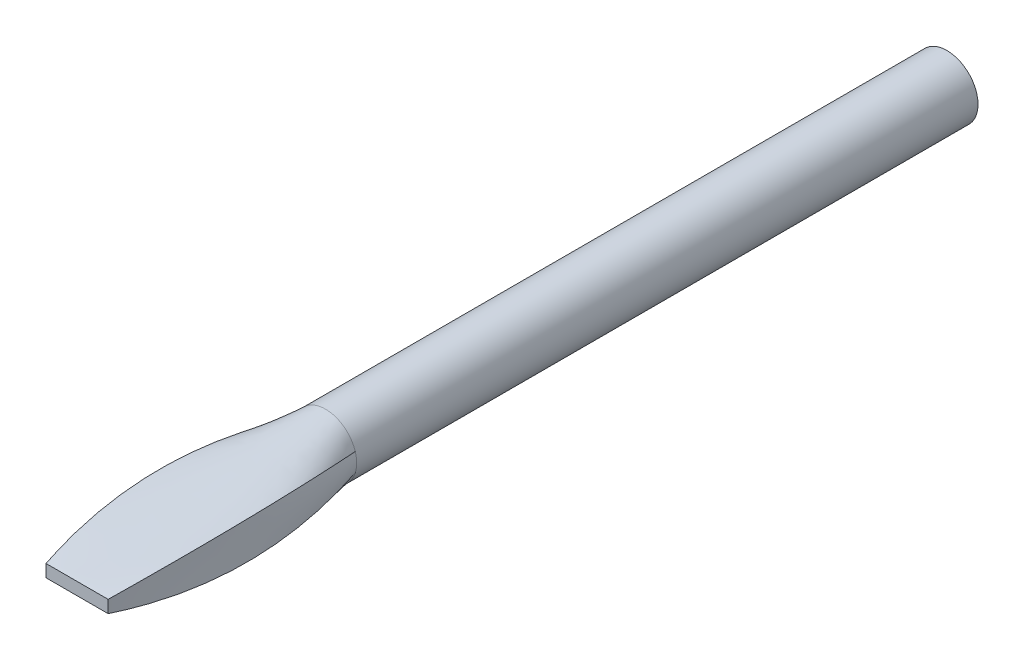
ISO-10303-21;
HEADER;
FILE_DESCRIPTION(('STEP AP214'),'2;1');
FILE_NAME('part.step','',(''),(''),'','','');
FILE_SCHEMA(('AUTOMOTIVE_DESIGN { 1 0 10303 214 1 1 1 1 }'));
ENDSEC;
DATA;
#1=APPLICATION_CONTEXT('core data for automotive mechanical design processes');
#2=APPLICATION_PROTOCOL_DEFINITION('international standard','automotive_design',2000,#1);
#3=PRODUCT_CONTEXT('',#1,'mechanical');
#4=PRODUCT('Part','Part','',(#3));
#5=PRODUCT_RELATED_PRODUCT_CATEGORY('part','',(#4));
#6=PRODUCT_DEFINITION_FORMATION('','',#4);
#7=PRODUCT_DEFINITION_CONTEXT('part definition',#1,'design');
#8=PRODUCT_DEFINITION('design','',#6,#7);
#9=PRODUCT_DEFINITION_SHAPE('','',#8);
#10=(LENGTH_UNIT() NAMED_UNIT(*) SI_UNIT(.MILLI.,.METRE.));
#11=(NAMED_UNIT(*) PLANE_ANGLE_UNIT() SI_UNIT($,.RADIAN.));
#12=(NAMED_UNIT(*) SI_UNIT($,.STERADIAN.) SOLID_ANGLE_UNIT());
#13=UNCERTAINTY_MEASURE_WITH_UNIT(LENGTH_MEASURE(1.E-05),#10,'distance_accuracy_value','');
#14=(GEOMETRIC_REPRESENTATION_CONTEXT(3) GLOBAL_UNCERTAINTY_ASSIGNED_CONTEXT((#13)) GLOBAL_UNIT_ASSIGNED_CONTEXT((#10,
#11,#12)) REPRESENTATION_CONTEXT('',''));
#15=CARTESIAN_POINT('',(0.,0.,0.));
#16=DIRECTION('',(0.,0.,1.));
#17=DIRECTION('',(1.,0.,0.));
#18=AXIS2_PLACEMENT_3D('',#15,#16,#17);
#19=CARTESIAN_POINT('',(0.,0.,-50.8));
#20=DIRECTION('',(0.,0.,-1.));
#21=DIRECTION('',(-1.,0.,0.));
#22=AXIS2_PLACEMENT_3D('',#19,#20,#21);
#23=CYLINDRICAL_SURFACE('',#22,6.35);
#24=CARTESIAN_POINT('',(6.06423657555215,1.88349004662501,-50.8));
#25=CARTESIAN_POINT('',(5.85804113848447,2.54737351838447,-50.8));
#26=CARTESIAN_POINT('',(5.2417074743179,3.76863298969801,-50.8));
#27=CARTESIAN_POINT('',(4.06203593613262,4.95911676968399,-50.8));
#28=CARTESIAN_POINT('',(2.93504285366169,5.65907860035766,-50.8));
#29=CARTESIAN_POINT('',(1.71223348435848,6.18054823227697,-50.8));
#30=CARTESIAN_POINT('',(-0.000193322838781427,6.46351838530499,-50.8));
#31=CARTESIAN_POINT('',(-1.71185651781168,6.18061152104127,-50.7999999999999));
#32=CARTESIAN_POINT('',(-2.935103628648,5.65908154799099,-50.8000000000001));
#33=CARTESIAN_POINT('',(-4.06188804313585,4.95920080897502,-50.8));
#34=CARTESIAN_POINT('',(-5.24179598211128,3.76858211592941,-50.8));
#35=CARTESIAN_POINT('',(-5.85804113848447,2.54737351838447,-50.8));
#36=CARTESIAN_POINT('',(-6.06423657555215,1.88349004662501,-50.8));
#37=B_SPLINE_CURVE_WITH_KNOTS('',3,(#24,#25,#26,#27,#28,#29,#30,#31,#32,#33,#34,#35,#36),
.UNSPECIFIED.,.F.,.F.,(4,1,1,1,1,1,1,1,1,1,4),(0.,0.125,0.25,0.3125,0.375,0.5,0.625,0.6875,0.75,
0.875,1.),.UNSPECIFIED.);
#38=CARTESIAN_POINT('',(6.06427068664734,1.88350064960726,-50.8));
#39=VERTEX_POINT('',#38);
#40=CARTESIAN_POINT('',(-6.06427243663805,1.88350118339388,-50.8));
#41=VERTEX_POINT('',#40);
#42=EDGE_CURVE('E12',#39,#41,#37,.T.);
#43=ORIENTED_EDGE('',*,*,#42,.F.);
#44=CARTESIAN_POINT('',(0.,0.,-50.8));
#45=DIRECTION('',(0.,0.,-1.));
#46=DIRECTION('',(1.,0.,0.));
#47=AXIS2_PLACEMENT_3D('',#44,#45,#46);
#48=CIRCLE('',#47,6.35);
#49=CARTESIAN_POINT('',(6.06427243663801,-1.88350118339387,-50.8));
#50=VERTEX_POINT('',#49);
#51=EDGE_CURVE('E126',#50,#39,#48,.F.);
#52=ORIENTED_EDGE('',*,*,#51,.F.);
#53=CARTESIAN_POINT('',(0.,0.,-50.8));
#54=DIRECTION('',(0.,0.,1.));
#55=DIRECTION('',(1.,0.,0.));
#56=AXIS2_PLACEMENT_3D('',#53,#54,#55);
#57=CIRCLE('',#56,6.35);
#58=CARTESIAN_POINT('',(-6.06427068664692,-1.88350064960712,-50.8));
#59=VERTEX_POINT('',#58);
#60=EDGE_CURVE('E113',#59,#50,#57,.T.);
#61=ORIENTED_EDGE('',*,*,#60,.F.);
#62=CARTESIAN_POINT('',(0.,0.,-50.8));
#63=DIRECTION('',(0.,0.,1.));
#64=DIRECTION('',(1.,0.,0.));
#65=AXIS2_PLACEMENT_3D('',#62,#63,#64);
#66=CIRCLE('',#65,6.35);
#67=EDGE_CURVE('E131',#41,#59,#66,.T.);
#68=ORIENTED_EDGE('',*,*,#67,.F.);
#69=EDGE_LOOP('',(#43,#52,#61,#68));
#70=FACE_BOUND('',#69,.T.);
#71=CARTESIAN_POINT('',(0.,0.,-177.8));
#72=DIRECTION('',(0.,0.,1.));
#73=DIRECTION('',(1.,0.,0.));
#74=AXIS2_PLACEMENT_3D('',#71,#72,#73);
#75=CIRCLE('',#74,6.35);
#76=CARTESIAN_POINT('',(6.35,0.,-177.8));
#77=VERTEX_POINT('',#76);
#78=EDGE_CURVE('E119',#77,#77,#75,.T.);
#79=ORIENTED_EDGE('',*,*,#78,.T.);
#80=EDGE_LOOP('',(#79));
#81=FACE_BOUND('',#80,.T.);
#82=ADVANCED_FACE('F109',(#70,#81),#23,.T.);
#83=CARTESIAN_POINT('',(0.,0.,-177.8));
#84=DIRECTION('',(0.,0.,1.));
#85=DIRECTION('',(1.,0.,0.));
#86=AXIS2_PLACEMENT_3D('',#83,#84,#85);
#87=PLANE('',#86);
#88=ORIENTED_EDGE('',*,*,#78,.F.);
#89=EDGE_LOOP('',(#88));
#90=FACE_BOUND('',#89,.T.);
#91=ADVANCED_FACE('F300',(#90),#87,.F.);
#92=CARTESIAN_POINT('',(0.,0.,0.));
#93=DIRECTION('',(0.,0.,1.));
#94=DIRECTION('',(1.,0.,0.));
#95=AXIS2_PLACEMENT_3D('',#92,#93,#94);
#96=PLANE('',#95);
#97=DIRECTION('',(0.,-1.,0.));
#98=VECTOR('',#97,1.);
#99=CARTESIAN_POINT('',(-6.35,1.27,0.));
#100=LINE('',#99,#98);
#101=CARTESIAN_POINT('',(-6.35,1.27,0.));
#102=VERTEX_POINT('',#101);
#103=CARTESIAN_POINT('',(-6.35,-1.27,0.));
#104=VERTEX_POINT('',#103);
#105=EDGE_CURVE('E156',#102,#104,#100,.T.);
#106=ORIENTED_EDGE('',*,*,#105,.T.);
#107=DIRECTION('',(1.,0.,0.));
#108=VECTOR('',#107,1.);
#109=CARTESIAN_POINT('',(-6.35,-1.27,0.));
#110=LINE('',#109,#108);
#111=CARTESIAN_POINT('',(6.35,-1.27,0.));
#112=VERTEX_POINT('',#111);
#113=EDGE_CURVE('E176',#104,#112,#110,.T.);
#114=ORIENTED_EDGE('',*,*,#113,.T.);
#115=DIRECTION('',(0.,1.,0.));
#116=VECTOR('',#115,1.);
#117=CARTESIAN_POINT('',(6.35,1.27,0.));
#118=LINE('',#117,#116);
#119=CARTESIAN_POINT('',(6.35,1.27,0.));
#120=VERTEX_POINT('',#119);
#121=EDGE_CURVE('E158',#112,#120,#118,.T.);
#122=ORIENTED_EDGE('',*,*,#121,.T.);
#123=DIRECTION('',(-1.,0.,0.));
#124=VECTOR('',#123,1.);
#125=CARTESIAN_POINT('',(-6.35,1.27,0.));
#126=LINE('',#125,#124);
#127=EDGE_CURVE('E151',#120,#102,#126,.T.);
#128=ORIENTED_EDGE('',*,*,#127,.T.);
#129=EDGE_LOOP('',(#106,#114,#122,#128));
#130=FACE_BOUND('',#129,.T.);
#131=ADVANCED_FACE('F154',(#130),#96,.T.);
#132=CARTESIAN_POINT('',(6.06423657555215,1.88349004662501,-50.8));
#133=CARTESIAN_POINT('',(7.90047388974248,3.27003054932142,-42.3293746512095));
#134=CARTESIAN_POINT('',(9.78431553948999,4.55437215944736,-25.3961706986833));
#135=CARTESIAN_POINT('',(8.09098283937438,2.86103718490474,-8.46270798454288));
#136=CARTESIAN_POINT('',(6.35,1.27,0.));
#137=CARTESIAN_POINT('',(5.85804113848447,2.54737351838447,-50.8));
#138=CARTESIAN_POINT('',(7.42093232332861,3.616845288089,-42.3198769073977));
#139=CARTESIAN_POINT('',(8.89957221242282,4.43385460008674,-25.4056684434996));
#140=CARTESIAN_POINT('',(7.37656967394205,2.75504928625989,-8.45321024073105));
#141=CARTESIAN_POINT('',(5.82083333333333,1.27,0.));
#142=CARTESIAN_POINT('',(5.2417074743179,3.76863298969801,-50.8));
#143=CARTESIAN_POINT('',(6.25790640046964,4.20396729341881,-42.3008814197741));
#144=CARTESIAN_POINT('',(7.23210386280418,4.24609771557512,-25.4246639331323));
#145=CARTESIAN_POINT('',(5.94774334307739,2.54307348897019,-8.4342147531074));
#146=CARTESIAN_POINT('',(4.7625,1.27,0.));
#147=CARTESIAN_POINT('',(4.06203593613262,4.95911676968399,-50.8));
#148=CARTESIAN_POINT('',(4.66948548773717,4.80713068019484,-42.3118121008502));
#149=CARTESIAN_POINT('',(5.16931230338842,4.0423102869184,-25.4137332509001));
#150=CARTESIAN_POINT('',(4.25336526489078,2.34711738515885,-8.44514543418357));
#151=CARTESIAN_POINT('',(3.43958333333333,1.27,0.));
#152=CARTESIAN_POINT('',(2.93504285366169,5.65907860035766,-50.8));
#153=CARTESIAN_POINT('',(3.29269835402437,5.15660841909619,-42.3207888898428));
#154=CARTESIAN_POINT('',(3.55920865650742,3.92568919199222,-25.4047564609581));
#155=CARTESIAN_POINT('',(2.92371467758366,2.23066752189838,-8.45412222317609));
#156=CARTESIAN_POINT('',(2.38125,1.27,0.));
#157=CARTESIAN_POINT('',(1.71223348435848,6.18054823227697,-50.8));
#158=CARTESIAN_POINT('',(1.87051705532128,5.41832523587703,-42.3297426797861));
#159=CARTESIAN_POINT('',(1.96342095127046,3.83780479373292,-25.3958026700678));
#160=CARTESIAN_POINT('',(1.61085497517112,2.14455951136192,-8.46307601311945));
#161=CARTESIAN_POINT('',(1.32291666666667,1.27,0.));
#162=CARTESIAN_POINT('',(-0.000193322838781427,6.46351838530499,-50.8));
#163=CARTESIAN_POINT('',(-9.66702680043319E-05,5.56028155683576,-42.3357360755949));
#164=CARTESIAN_POINT('',(3.22497012284137E-05,3.79007273909321,-25.3898092736251));
#165=CARTESIAN_POINT('',(3.22301563003236E-05,2.0979805784034,-8.46906940892825));
#166=CARTESIAN_POINT('',(0.,1.27,0.));
#167=CARTESIAN_POINT('',(-1.71185651781168,6.18061152104127,-50.7999999999999));
#168=CARTESIAN_POINT('',(-1.87032854552464,5.41835704516322,-42.3297440608275));
#169=CARTESIAN_POINT('',(-1.96348383556476,3.83779408565037,-25.3958012890262));
#170=CARTESIAN_POINT('',(-1.61091783200104,2.14454909881991,-8.46307739416092));
#171=CARTESIAN_POINT('',(-1.32291666666667,1.27,0.));
#172=CARTESIAN_POINT('',(-2.935103628648,5.65908154799099,-50.8000000000001));
#173=CARTESIAN_POINT('',(-3.29272887156439,5.15660981106642,-42.3207888521752));
#174=CARTESIAN_POINT('',(-3.559198434286,3.92568875573983,-25.4047564986257));
#175=CARTESIAN_POINT('',(-2.92370458580722,2.23066700155333,-8.45412218550851));
#176=CARTESIAN_POINT('',(-2.38125,1.27,0.));
#177=CARTESIAN_POINT('',(-4.06188804313585,4.95920080897502,-50.8));
#178=CARTESIAN_POINT('',(-4.66941085262581,4.80717319138082,-42.3118133437021));
#179=CARTESIAN_POINT('',(-5.16933741344583,4.04229591953955,-25.4137320080481));
#180=CARTESIAN_POINT('',(-4.25338972546873,2.34710358282778,-8.44514667703548));
#181=CARTESIAN_POINT('',(-3.43958333333333,1.27,0.));
#182=CARTESIAN_POINT('',(-5.24179598211128,3.76858211592941,-50.8));
#183=CARTESIAN_POINT('',(-6.2579566773203,4.20393834953867,-42.3008807415742));
#184=CARTESIAN_POINT('',(-7.23208509401576,4.24610854884719,-25.4246646113323));
#185=CARTESIAN_POINT('',(-5.94773057480386,2.54308078297502,-8.43421407490755));
#186=CARTESIAN_POINT('',(-4.7625,1.27,0.));
#187=CARTESIAN_POINT('',(-5.85804113848447,2.54737351838447,-50.8));
#188=CARTESIAN_POINT('',(-7.42091957968103,3.61685259805183,-42.3198766813311));
#189=CARTESIAN_POINT('',(-8.89958071424488,4.43384972831545,-25.4056686695663));
#190=CARTESIAN_POINT('',(-7.37656541785087,2.75505171759483,-8.45321001466444));
#191=CARTESIAN_POINT('',(-5.82083333333333,1.27,0.));
#192=CARTESIAN_POINT('',(-6.06423657555215,1.88349004662501,-50.8));
#193=CARTESIAN_POINT('',(-7.90047388974248,3.27003054932142,-42.3293746512095));
#194=CARTESIAN_POINT('',(-9.78431553948999,4.55437215944736,-25.3961706986833));
#195=CARTESIAN_POINT('',(-8.09098283937437,2.86103718490474,-8.46270798454288));
#196=CARTESIAN_POINT('',(-6.35,1.27,0.));
#197=B_SPLINE_SURFACE_WITH_KNOTS('',3,3,((#132,#133,#134,#135,#136),(#137,#138,#139,#140,#141),
(#142,#143,#144,#145,#146),(#147,#148,#149,#150,#151),(#152,#153,#154,#155,#156),(#157,#158,
#159,#160,#161),(#162,#163,#164,#165,#166),(#167,#168,#169,#170,#171),(#172,#173,#174,#175,
#176),(#177,#178,#179,#180,#181),(#182,#183,#184,#185,#186),(#187,#188,#189,#190,#191),(#192,
#193,#194,#195,#196)),.UNSPECIFIED.,.F.,.F.,.F.,(4,1,1,1,1,1,1,1,1,1,4),(4,1,4),(0.,0.125,0.25,
0.3125,0.375,0.5,0.625,0.6875,0.75,0.875,1.),(0.,0.49988501992942,1.),.UNSPECIFIED.);
#198=CARTESIAN_POINT('',(-6.06423657555215,1.88349004662501,-50.8));
#199=CARTESIAN_POINT('',(-7.90047388974248,3.27003054932142,-42.3293746512095));
#200=CARTESIAN_POINT('',(-9.78431553948999,4.55437215944736,-25.3961706986833));
#201=CARTESIAN_POINT('',(-8.09098283937437,2.86103718490474,-8.46270798454288));
#202=CARTESIAN_POINT('',(-6.35,1.27,0.));
#203=B_SPLINE_CURVE_WITH_KNOTS('',3,(#198,#199,#200,#201,#202),.UNSPECIFIED.,.F.,.F.,(4,1,4),
(0.,0.49988501992942,1.),.UNSPECIFIED.);
#204=EDGE_CURVE('E173',#41,#102,#203,.T.);
#205=CARTESIAN_POINT('',(6.06423657555215,1.88349004662501,-50.8));
#206=CARTESIAN_POINT('',(7.90047388974248,3.27003054932142,-42.3293746512095));
#207=CARTESIAN_POINT('',(9.78431553948999,4.55437215944736,-25.3961706986833));
#208=CARTESIAN_POINT('',(8.09098283937438,2.86103718490474,-8.46270798454288));
#209=CARTESIAN_POINT('',(6.35,1.27,0.));
#210=B_SPLINE_CURVE_WITH_KNOTS('',3,(#205,#206,#207,#208,#209),.UNSPECIFIED.,.F.,.F.,(4,1,4),
(0.,0.49988501992942,1.),.UNSPECIFIED.);
#211=EDGE_CURVE('E164',#120,#39,#210,.F.);
#212=ORIENTED_EDGE('',*,*,#42,.T.);
#213=ORIENTED_EDGE('',*,*,#204,.T.);
#214=ORIENTED_EDGE('',*,*,#127,.F.);
#215=ORIENTED_EDGE('',*,*,#211,.T.);
#216=EDGE_LOOP('',(#212,#213,#214,#215));
#217=FACE_BOUND('',#216,.T.);
#218=ADVANCED_FACE('F180',(#217),#197,.T.);
#219=CARTESIAN_POINT('',(-6.06423657555215,1.88349004662501,-50.8));
#220=CARTESIAN_POINT('',(-7.90047388974248,3.27003054932142,-42.3293746512095));
#221=CARTESIAN_POINT('',(-9.78431553948999,4.55437215944736,-25.3961706986833));
#222=CARTESIAN_POINT('',(-8.09098283937438,2.86103718490474,-8.46270798454288));
#223=CARTESIAN_POINT('',(-6.35,1.27,0.));
#224=CARTESIAN_POINT('',(-6.44524440048445,0.656766501328778,-50.8));
#225=CARTESIAN_POINT('',(-8.28148171467478,1.11894666889425,-42.3293746512095));
#226=CARTESIAN_POINT('',(-9.59372399025768,1.50364915448665,-25.3961706986833));
#227=CARTESIAN_POINT('',(-8.09098283937438,0.953679061634914,-8.46270798454288));
#228=CARTESIAN_POINT('',(-6.35,0.423333333333333,0.));
#229=CARTESIAN_POINT('',(-6.44524440048445,-0.656766501328776,-50.8));
#230=CARTESIAN_POINT('',(-8.28148171467478,-1.11894666889424,-42.3293746512095));
#231=CARTESIAN_POINT('',(-9.59372399025768,-1.50364915448665,-25.3961706986833));
#232=CARTESIAN_POINT('',(-8.09098283937438,-0.953679061634914,-8.46270798454288));
#233=CARTESIAN_POINT('',(-6.35,-0.423333333333333,0.));
#234=CARTESIAN_POINT('',(-6.06423657555215,-1.88349004662501,-50.8));
#235=CARTESIAN_POINT('',(-7.90047388974248,-3.27003054932142,-42.3293746512095));
#236=CARTESIAN_POINT('',(-9.78431553948999,-4.55437215944736,-25.3961706986833));
#237=CARTESIAN_POINT('',(-8.09098283937438,-2.86103718490474,-8.46270798454288));
#238=CARTESIAN_POINT('',(-6.35,-1.27,0.));
#239=B_SPLINE_SURFACE_WITH_KNOTS('',3,3,((#219,#220,#221,#222,#223),(#224,#225,#226,#227,#228),
(#229,#230,#231,#232,#233),(#234,#235,#236,#237,#238)),.UNSPECIFIED.,.F.,.F.,.F.,(4,4),(4,1,4),
(0.,1.),(0.,0.49988501992942,1.),.UNSPECIFIED.);
#240=CARTESIAN_POINT('',(-6.06423657555215,-1.88349004662501,-50.8));
#241=CARTESIAN_POINT('',(-7.90047388974248,-3.27003054932142,-42.3293746512095));
#242=CARTESIAN_POINT('',(-9.78431553948999,-4.55437215944736,-25.3961706986833));
#243=CARTESIAN_POINT('',(-8.09098283937438,-2.86103718490474,-8.46270798454288));
#244=CARTESIAN_POINT('',(-6.35,-1.27,0.));
#245=B_SPLINE_CURVE_WITH_KNOTS('',3,(#240,#241,#242,#243,#244),.UNSPECIFIED.,.F.,.F.,(4,1,4),
(0.,0.49988501992942,1.),.UNSPECIFIED.);
#246=EDGE_CURVE('E175',#59,#104,#245,.T.);
#247=ORIENTED_EDGE('',*,*,#67,.T.);
#248=ORIENTED_EDGE('',*,*,#246,.T.);
#249=ORIENTED_EDGE('',*,*,#105,.F.);
#250=ORIENTED_EDGE('',*,*,#204,.F.);
#251=EDGE_LOOP('',(#247,#248,#249,#250));
#252=FACE_BOUND('',#251,.T.);
#253=ADVANCED_FACE('F172',(#252),#239,.T.);
#254=CARTESIAN_POINT('',(6.06423657555215,-1.88349004662502,-50.8));
#255=CARTESIAN_POINT('',(7.90047388974248,-3.27003054932142,-42.3293746512095));
#256=CARTESIAN_POINT('',(9.78431553948999,-4.55437215944736,-25.3961706986833));
#257=CARTESIAN_POINT('',(8.09098283937438,-2.86103718490474,-8.46270798454288));
#258=CARTESIAN_POINT('',(6.35,-1.27,0.));
#259=CARTESIAN_POINT('',(6.44524440048445,-0.65676650132878,-50.8));
#260=CARTESIAN_POINT('',(8.28148171467478,-1.11894666889425,-42.3293746512095));
#261=CARTESIAN_POINT('',(9.59372399025768,-1.50364915448665,-25.3961706986833));
#262=CARTESIAN_POINT('',(8.09098283937438,-0.953679061634913,-8.46270798454288));
#263=CARTESIAN_POINT('',(6.35,-0.423333333333333,0.));
#264=CARTESIAN_POINT('',(6.44524440048445,0.656766501328776,-50.8));
#265=CARTESIAN_POINT('',(8.28148171467478,1.11894666889425,-42.3293746512095));
#266=CARTESIAN_POINT('',(9.59372399025768,1.50364915448665,-25.3961706986833));
#267=CARTESIAN_POINT('',(8.09098283937438,0.953679061634914,-8.46270798454288));
#268=CARTESIAN_POINT('',(6.35,0.423333333333334,0.));
#269=CARTESIAN_POINT('',(6.06423657555215,1.88349004662501,-50.8));
#270=CARTESIAN_POINT('',(7.90047388974248,3.27003054932142,-42.3293746512095));
#271=CARTESIAN_POINT('',(9.78431553948999,4.55437215944736,-25.3961706986833));
#272=CARTESIAN_POINT('',(8.09098283937438,2.86103718490474,-8.46270798454288));
#273=CARTESIAN_POINT('',(6.35,1.27,0.));
#274=B_SPLINE_SURFACE_WITH_KNOTS('',3,3,((#254,#255,#256,#257,#258),(#259,#260,#261,#262,#263),
(#264,#265,#266,#267,#268),(#269,#270,#271,#272,#273)),.UNSPECIFIED.,.F.,.F.,.F.,(4,4),(4,1,4),
(0.,1.),(0.,0.49988501992942,1.),.UNSPECIFIED.);
#275=CARTESIAN_POINT('',(6.06423657555215,-1.88349004662502,-50.8));
#276=CARTESIAN_POINT('',(7.90047388974247,-3.27003054932142,-42.3293746512095));
#277=CARTESIAN_POINT('',(9.78431553948999,-4.55437215944735,-25.3961706986833));
#278=CARTESIAN_POINT('',(8.09098283937437,-2.86103718490474,-8.46270798454288));
#279=CARTESIAN_POINT('',(6.35,-1.27,0.));
#280=B_SPLINE_CURVE_WITH_KNOTS('',3,(#275,#276,#277,#278,#279),.UNSPECIFIED.,.F.,.F.,(4,1,4),
(0.,0.49988501992942,1.),.UNSPECIFIED.);
#281=EDGE_CURVE('E270',#50,#112,#280,.T.);
#282=ORIENTED_EDGE('',*,*,#51,.T.);
#283=ORIENTED_EDGE('',*,*,#211,.F.);
#284=ORIENTED_EDGE('',*,*,#121,.F.);
#285=ORIENTED_EDGE('',*,*,#281,.F.);
#286=EDGE_LOOP('',(#282,#283,#284,#285));
#287=FACE_BOUND('',#286,.T.);
#288=ADVANCED_FACE('F296',(#287),#274,.T.);
#289=CARTESIAN_POINT('',(-6.06423657555215,-1.88349004662501,-50.8));
#290=CARTESIAN_POINT('',(-7.90047388974248,-3.27003054932142,-42.3293746512095));
#291=CARTESIAN_POINT('',(-9.78431553948999,-4.55437215944736,-25.3961706986833));
#292=CARTESIAN_POINT('',(-8.09098283937438,-2.86103718490474,-8.46270798454288));
#293=CARTESIAN_POINT('',(-6.35,-1.27,0.));
#294=CARTESIAN_POINT('',(-5.85804113848447,-2.54737351838447,-50.8));
#295=CARTESIAN_POINT('',(-7.42093232332861,-3.616845288089,-42.3198769073977));
#296=CARTESIAN_POINT('',(-8.89957221242282,-4.43385460008674,-25.4056684434996));
#297=CARTESIAN_POINT('',(-7.37656967394205,-2.75504928625989,-8.45321024073105));
#298=CARTESIAN_POINT('',(-5.82083333333333,-1.27,0.));
#299=CARTESIAN_POINT('',(-5.24170747431789,-3.76863298969801,-50.7999999999999));
#300=CARTESIAN_POINT('',(-6.25790640046964,-4.2039672934188,-42.300881419774));
#301=CARTESIAN_POINT('',(-7.23210386280419,-4.24609771557513,-25.4246639331324));
#302=CARTESIAN_POINT('',(-5.94774334307739,-2.54307348897019,-8.4342147531074));
#303=CARTESIAN_POINT('',(-4.7625,-1.27,0.));
#304=CARTESIAN_POINT('',(-4.06203593613262,-4.95911676968398,-50.8));
#305=CARTESIAN_POINT('',(-4.66948548773717,-4.80713068019482,-42.3118121008502));
#306=CARTESIAN_POINT('',(-5.16931230338842,-4.0423102869184,-25.4137332509001));
#307=CARTESIAN_POINT('',(-4.25336526489078,-2.34711738515885,-8.44514543418357));
#308=CARTESIAN_POINT('',(-3.43958333333333,-1.27,0.));
#309=CARTESIAN_POINT('',(-2.9350428536617,-5.65907860035766,-50.8));
#310=CARTESIAN_POINT('',(-3.29269835402437,-5.1566084190962,-42.3207888898428));
#311=CARTESIAN_POINT('',(-3.55920865650742,-3.92568919199222,-25.4047564609581));
#312=CARTESIAN_POINT('',(-2.92371467758366,-2.23066752189838,-8.45412222317609));
#313=CARTESIAN_POINT('',(-2.38125,-1.27,0.));
#314=CARTESIAN_POINT('',(-1.71223348435848,-6.18054823227697,-50.8));
#315=CARTESIAN_POINT('',(-1.87051705532128,-5.41832523587702,-42.329742679786));
#316=CARTESIAN_POINT('',(-1.96342095127046,-3.83780479373293,-25.3958026700679));
#317=CARTESIAN_POINT('',(-1.61085497517112,-2.14455951136192,-8.46307601311945));
#318=CARTESIAN_POINT('',(-1.32291666666667,-1.27,0.));
#319=CARTESIAN_POINT('',(0.00019332283877644,-6.46351838530499,-50.8000000000001));
#320=CARTESIAN_POINT('',(9.66702680018577E-05,-5.56028155683576,-42.335736075595));
#321=CARTESIAN_POINT('',(-3.22497012273331E-05,-3.7900727390932,-25.3898092736251));
#322=CARTESIAN_POINT('',(-3.22301563000095E-05,-2.09798057840341,-8.46906940892825));
#323=CARTESIAN_POINT('',(0.,-1.27,0.));
#324=CARTESIAN_POINT('',(1.71185651781167,-6.18061152104127,-50.7999999999999));
#325=CARTESIAN_POINT('',(1.87032854552464,-5.41835704516323,-42.3297440608275));
#326=CARTESIAN_POINT('',(1.96348383556476,-3.83779408565036,-25.3958012890262));
#327=CARTESIAN_POINT('',(1.61091783200104,-2.1445490988199,-8.46307739416092));
#328=CARTESIAN_POINT('',(1.32291666666667,-1.27,0.));
#329=CARTESIAN_POINT('',(2.93510362864799,-5.65908154799099,-50.8000000000001));
#330=CARTESIAN_POINT('',(3.29272887156439,-5.15660981106641,-42.3207888521753));
#331=CARTESIAN_POINT('',(3.559198434286,-3.92568875573983,-25.4047564986257));
#332=CARTESIAN_POINT('',(2.92370458580723,-2.23066700155334,-8.45412218550851));
#333=CARTESIAN_POINT('',(2.38125,-1.27,0.));
#334=CARTESIAN_POINT('',(4.06188804313585,-4.95920080897503,-50.7999999999999));
#335=CARTESIAN_POINT('',(4.6694108526258,-4.80717319138083,-42.3118133437021));
#336=CARTESIAN_POINT('',(5.16933741344583,-4.04229591953955,-25.4137320080481));
#337=CARTESIAN_POINT('',(4.25338972546873,-2.34710358282778,-8.44514667703548));
#338=CARTESIAN_POINT('',(3.43958333333333,-1.27,0.));
#339=CARTESIAN_POINT('',(5.24179598211128,-3.7685821159294,-50.8));
#340=CARTESIAN_POINT('',(6.2579566773203,-4.20393834953867,-42.3008807415742));
#341=CARTESIAN_POINT('',(7.23208509401575,-4.24610854884719,-25.4246646113323));
#342=CARTESIAN_POINT('',(5.94773057480386,-2.54308078297502,-8.43421407490754));
#343=CARTESIAN_POINT('',(4.7625,-1.27,0.));
#344=CARTESIAN_POINT('',(5.85804113848447,-2.54737351838447,-50.8));
#345=CARTESIAN_POINT('',(7.42091957968103,-3.61685259805183,-42.3198766813311));
#346=CARTESIAN_POINT('',(8.89958071424488,-4.43384972831545,-25.4056686695663));
#347=CARTESIAN_POINT('',(7.37656541785087,-2.75505171759483,-8.45321001466444));
#348=CARTESIAN_POINT('',(5.82083333333333,-1.27,0.));
#349=CARTESIAN_POINT('',(6.06423657555215,-1.88349004662502,-50.8));
#350=CARTESIAN_POINT('',(7.90047388974247,-3.27003054932142,-42.3293746512095));
#351=CARTESIAN_POINT('',(9.78431553948999,-4.55437215944735,-25.3961706986833));
#352=CARTESIAN_POINT('',(8.09098283937437,-2.86103718490474,-8.46270798454288));
#353=CARTESIAN_POINT('',(6.35,-1.27,0.));
#354=B_SPLINE_SURFACE_WITH_KNOTS('',3,3,((#289,#290,#291,#292,#293),(#294,#295,#296,#297,#298),
(#299,#300,#301,#302,#303),(#304,#305,#306,#307,#308),(#309,#310,#311,#312,#313),(#314,#315,
#316,#317,#318),(#319,#320,#321,#322,#323),(#324,#325,#326,#327,#328),(#329,#330,#331,#332,
#333),(#334,#335,#336,#337,#338),(#339,#340,#341,#342,#343),(#344,#345,#346,#347,#348),(#349,
#350,#351,#352,#353)),.UNSPECIFIED.,.F.,.F.,.F.,(4,1,1,1,1,1,1,1,1,1,4),(4,1,4),(0.,0.125,0.25,
0.3125,0.375,0.5,0.625,0.6875,0.75,0.875,1.),(0.,0.49988501992942,1.),.UNSPECIFIED.);
#355=ORIENTED_EDGE('',*,*,#60,.T.);
#356=ORIENTED_EDGE('',*,*,#281,.T.);
#357=ORIENTED_EDGE('',*,*,#113,.F.);
#358=ORIENTED_EDGE('',*,*,#246,.F.);
#359=EDGE_LOOP('',(#355,#356,#357,#358));
#360=FACE_BOUND('',#359,.T.);
#361=ADVANCED_FACE('F275',(#360),#354,.T.);
#362=CLOSED_SHELL('',(#82,#91,#131,#218,#253,#288,#361));
#363=MANIFOLD_SOLID_BREP('B2',#362);
#364=ADVANCED_BREP_SHAPE_REPRESENTATION('',(#18,#363),#14);
#365=SHAPE_DEFINITION_REPRESENTATION(#9,#364);
ENDSEC;
END-ISO-10303-21;
